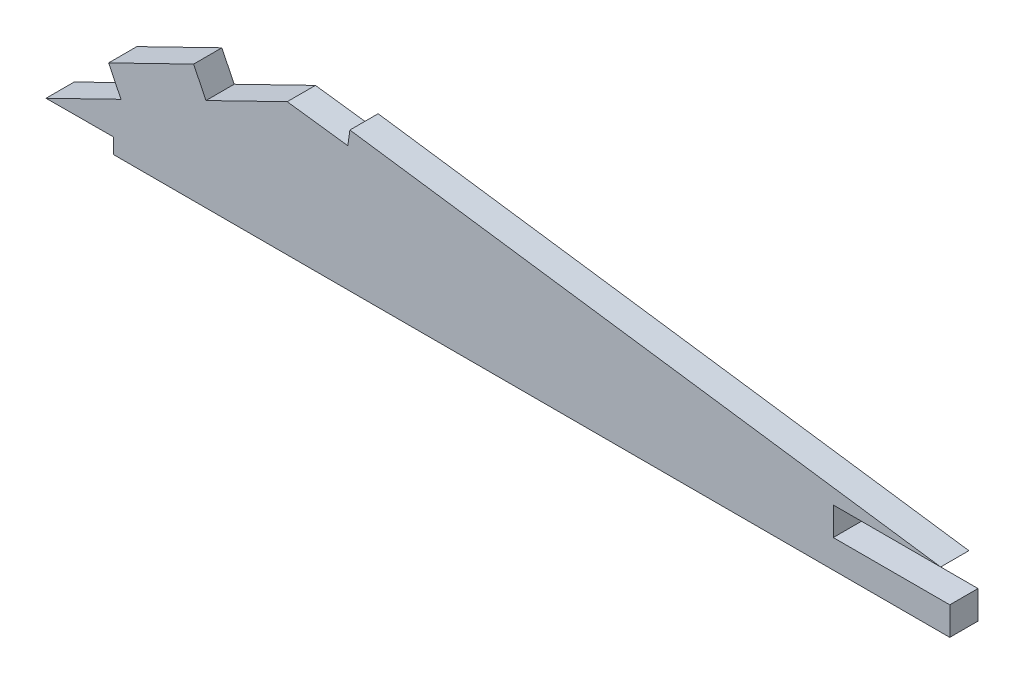
ISO-10303-21;
HEADER;
FILE_DESCRIPTION(('STEP AP214'),'2;1');
FILE_NAME('part.step','',(''),(''),'','','');
FILE_SCHEMA(('AUTOMOTIVE_DESIGN { 1 0 10303 214 1 1 1 1 }'));
ENDSEC;
DATA;
#1=APPLICATION_CONTEXT('core data for automotive mechanical design processes');
#2=APPLICATION_PROTOCOL_DEFINITION('international standard','automotive_design',2000,#1);
#3=PRODUCT_CONTEXT('',#1,'mechanical');
#4=PRODUCT('Part','Part','',(#3));
#5=PRODUCT_RELATED_PRODUCT_CATEGORY('part','',(#4));
#6=PRODUCT_DEFINITION_FORMATION('','',#4);
#7=PRODUCT_DEFINITION_CONTEXT('part definition',#1,'design');
#8=PRODUCT_DEFINITION('design','',#6,#7);
#9=PRODUCT_DEFINITION_SHAPE('','',#8);
#10=(LENGTH_UNIT() NAMED_UNIT(*) SI_UNIT(.MILLI.,.METRE.));
#11=(NAMED_UNIT(*) PLANE_ANGLE_UNIT() SI_UNIT($,.RADIAN.));
#12=(NAMED_UNIT(*) SI_UNIT($,.STERADIAN.) SOLID_ANGLE_UNIT());
#13=UNCERTAINTY_MEASURE_WITH_UNIT(LENGTH_MEASURE(1.E-05),#10,'distance_accuracy_value','');
#14=(GEOMETRIC_REPRESENTATION_CONTEXT(3) GLOBAL_UNCERTAINTY_ASSIGNED_CONTEXT((#13)) GLOBAL_UNIT_ASSIGNED_CONTEXT((#10,
#11,#12)) REPRESENTATION_CONTEXT('',''));
#15=CARTESIAN_POINT('',(0.,0.,0.));
#16=DIRECTION('',(0.,0.,1.));
#17=DIRECTION('',(1.,0.,0.));
#18=AXIS2_PLACEMENT_3D('',#15,#16,#17);
#19=CARTESIAN_POINT('',(6.87014244644078,3.92865761709263,2.));
#20=DIRECTION('',(-0.00388084579369452,0.999992469489609,0.));
#21=DIRECTION('',(-0.999992469489609,-0.00388084579369452,0.));
#22=AXIS2_PLACEMENT_3D('',#19,#20,#21);
#23=PLANE('',#22);
#24=DIRECTION('',(0.999992469489609,0.00388084579369452,0.));
#25=VECTOR('',#24,1.);
#26=CARTESIAN_POINT('',(6.87014244644078,3.92865761709263,0.));
#27=LINE('',#26,#25);
#28=CARTESIAN_POINT('',(2.08867664819272,3.91010134592361,0.));
#29=VERTEX_POINT('',#28);
#30=CARTESIAN_POINT('',(6.87014244644078,3.92865761709263,0.));
#31=VERTEX_POINT('',#30);
#32=EDGE_CURVE('E182',#29,#31,#27,.T.);
#33=ORIENTED_EDGE('',*,*,#32,.T.);
#34=DIRECTION('',(0.,0.,-1.));
#35=VECTOR('',#34,1.);
#36=CARTESIAN_POINT('',(6.87014244644078,3.92865761709263,2.));
#37=LINE('',#36,#35);
#38=CARTESIAN_POINT('',(6.87014244644078,3.92865761709263,2.));
#39=VERTEX_POINT('',#38);
#40=EDGE_CURVE('E11',#39,#31,#37,.T.);
#41=ORIENTED_EDGE('',*,*,#40,.F.);
#42=DIRECTION('',(0.999992469489609,0.00388084579369452,0.));
#43=VECTOR('',#42,1.);
#44=CARTESIAN_POINT('',(6.87014244644078,3.92865761709263,2.));
#45=LINE('',#44,#43);
#46=CARTESIAN_POINT('',(2.08867664819272,3.91010134592361,2.));
#47=VERTEX_POINT('',#46);
#48=EDGE_CURVE('E225',#47,#39,#45,.T.);
#49=ORIENTED_EDGE('',*,*,#48,.F.);
#50=DIRECTION('',(0.,0.,-1.));
#51=VECTOR('',#50,1.);
#52=CARTESIAN_POINT('',(2.08867664819272,3.91010134592361,2.));
#53=LINE('',#52,#51);
#54=EDGE_CURVE('E178',#47,#29,#53,.T.);
#55=ORIENTED_EDGE('',*,*,#54,.T.);
#56=EDGE_LOOP('',(#33,#41,#49,#55));
#57=FACE_BOUND('',#56,.T.);
#58=ADVANCED_FACE('F39',(#57),#23,.F.);
#59=CARTESIAN_POINT('',(6.87434607090663,2.84549352427084,2.));
#60=DIRECTION('',(0.99999246948962,0.00388084579083142,0.));
#61=DIRECTION('',(-0.00388084579083142,0.99999246948962,0.));
#62=AXIS2_PLACEMENT_3D('',#59,#60,#61);
#63=PLANE('',#62);
#64=DIRECTION('',(0.00388084579083142,-0.99999246948962,0.));
#65=VECTOR('',#64,1.);
#66=CARTESIAN_POINT('',(6.87434607090663,2.84549352427084,0.));
#67=LINE('',#66,#65);
#68=CARTESIAN_POINT('',(6.87434607090663,2.84549352427084,0.));
#69=VERTEX_POINT('',#68);
#70=EDGE_CURVE('E186',#31,#69,#67,.T.);
#71=ORIENTED_EDGE('',*,*,#70,.T.);
#72=DIRECTION('',(0.,0.,-1.));
#73=VECTOR('',#72,1.);
#74=CARTESIAN_POINT('',(6.87434607090663,2.84549352427084,2.));
#75=LINE('',#74,#73);
#76=CARTESIAN_POINT('',(6.87434607090663,2.84549352427084,2.));
#77=VERTEX_POINT('',#76);
#78=EDGE_CURVE('E48',#77,#69,#75,.T.);
#79=ORIENTED_EDGE('',*,*,#78,.F.);
#80=DIRECTION('',(0.00388084579083142,-0.99999246948962,0.));
#81=VECTOR('',#80,1.);
#82=CARTESIAN_POINT('',(6.87434607090663,2.84549352427084,2.));
#83=LINE('',#82,#81);
#84=EDGE_CURVE('E120',#39,#77,#83,.T.);
#85=ORIENTED_EDGE('',*,*,#84,.F.);
#86=ORIENTED_EDGE('',*,*,#40,.T.);
#87=EDGE_LOOP('',(#71,#79,#85,#86));
#88=FACE_BOUND('',#87,.T.);
#89=ADVANCED_FACE('F340',(#88),#63,.F.);
#90=CARTESIAN_POINT('',(6.87434607090663,2.84549352427084,2.));
#91=DIRECTION('',(0.,1.,0.));
#92=DIRECTION('',(0.,0.,1.));
#93=AXIS2_PLACEMENT_3D('',#90,#91,#92);
#94=PLANE('',#93);
#95=DIRECTION('',(1.,0.,0.));
#96=VECTOR('',#95,1.);
#97=CARTESIAN_POINT('',(6.87434607090663,2.84549352427084,0.));
#98=LINE('',#97,#96);
#99=CARTESIAN_POINT('',(66.1354490341429,2.84549352427084,0.));
#100=VERTEX_POINT('',#99);
#101=EDGE_CURVE('E189',#69,#100,#98,.T.);
#102=ORIENTED_EDGE('',*,*,#101,.T.);
#103=DIRECTION('',(0.,0.,-1.));
#104=VECTOR('',#103,1.);
#105=CARTESIAN_POINT('',(66.1354490341429,2.84549352427084,2.));
#106=LINE('',#105,#104);
#107=CARTESIAN_POINT('',(66.1354490341429,2.84549352427084,2.));
#108=VERTEX_POINT('',#107);
#109=EDGE_CURVE('E264',#108,#100,#106,.T.);
#110=ORIENTED_EDGE('',*,*,#109,.F.);
#111=DIRECTION('',(1.,0.,0.));
#112=VECTOR('',#111,1.);
#113=CARTESIAN_POINT('',(6.87434607090663,2.84549352427084,2.));
#114=LINE('',#113,#112);
#115=EDGE_CURVE('E274',#77,#108,#114,.T.);
#116=ORIENTED_EDGE('',*,*,#115,.F.);
#117=ORIENTED_EDGE('',*,*,#78,.T.);
#118=EDGE_LOOP('',(#102,#110,#116,#117));
#119=FACE_BOUND('',#118,.T.);
#120=ADVANCED_FACE('F272',(#119),#94,.F.);
#121=CARTESIAN_POINT('',(66.1354490341429,2.84549352427084,2.));
#122=DIRECTION('',(-1.,0.,0.));
#123=DIRECTION('',(0.,0.,1.));
#124=AXIS2_PLACEMENT_3D('',#121,#122,#123);
#125=PLANE('',#124);
#126=DIRECTION('',(0.,1.,0.));
#127=VECTOR('',#126,1.);
#128=CARTESIAN_POINT('',(66.1354490341429,2.84549352427084,0.));
#129=LINE('',#128,#127);
#130=CARTESIAN_POINT('',(66.1354490341429,4.84549352427084,0.));
#131=VERTEX_POINT('',#130);
#132=EDGE_CURVE('E192',#100,#131,#129,.T.);
#133=ORIENTED_EDGE('',*,*,#132,.T.);
#134=DIRECTION('',(0.,0.,-1.));
#135=VECTOR('',#134,1.);
#136=CARTESIAN_POINT('',(66.1354490341429,4.84549352427084,2.));
#137=LINE('',#136,#135);
#138=CARTESIAN_POINT('',(66.1354490341429,4.84549352427084,2.));
#139=VERTEX_POINT('',#138);
#140=EDGE_CURVE('E260',#139,#131,#137,.T.);
#141=ORIENTED_EDGE('',*,*,#140,.F.);
#142=DIRECTION('',(0.,1.,0.));
#143=VECTOR('',#142,1.);
#144=CARTESIAN_POINT('',(66.1354490341429,2.84549352427084,2.));
#145=LINE('',#144,#143);
#146=EDGE_CURVE('E293',#108,#139,#145,.T.);
#147=ORIENTED_EDGE('',*,*,#146,.F.);
#148=ORIENTED_EDGE('',*,*,#109,.T.);
#149=EDGE_LOOP('',(#133,#141,#147,#148));
#150=FACE_BOUND('',#149,.T.);
#151=ADVANCED_FACE('F283',(#150),#125,.F.);
#152=CARTESIAN_POINT('',(57.8792726381617,4.84549352427084,2.));
#153=DIRECTION('',(0.,-1.,0.));
#154=DIRECTION('',(0.,0.,-1.));
#155=AXIS2_PLACEMENT_3D('',#152,#153,#154);
#156=PLANE('',#155);
#157=DIRECTION('',(-1.,0.,0.));
#158=VECTOR('',#157,1.);
#159=CARTESIAN_POINT('',(57.8792726381617,4.84549352427084,0.));
#160=LINE('',#159,#158);
#161=CARTESIAN_POINT('',(57.8792726381617,4.84549352427084,0.));
#162=VERTEX_POINT('',#161);
#163=EDGE_CURVE('E195',#131,#162,#160,.T.);
#164=ORIENTED_EDGE('',*,*,#163,.T.);
#165=DIRECTION('',(0.,0.,-1.));
#166=VECTOR('',#165,1.);
#167=CARTESIAN_POINT('',(57.8792726381617,4.84549352427084,2.));
#168=LINE('',#167,#166);
#169=CARTESIAN_POINT('',(57.8792726381617,4.84549352427084,2.));
#170=VERTEX_POINT('',#169);
#171=EDGE_CURVE('E256',#170,#162,#168,.T.);
#172=ORIENTED_EDGE('',*,*,#171,.F.);
#173=DIRECTION('',(-1.,0.,0.));
#174=VECTOR('',#173,1.);
#175=CARTESIAN_POINT('',(57.8792726381617,4.84549352427084,2.));
#176=LINE('',#175,#174);
#177=EDGE_CURVE('E289',#139,#170,#176,.T.);
#178=ORIENTED_EDGE('',*,*,#177,.F.);
#179=ORIENTED_EDGE('',*,*,#140,.T.);
#180=EDGE_LOOP('',(#164,#172,#178,#179));
#181=FACE_BOUND('',#180,.T.);
#182=ADVANCED_FACE('F287',(#181),#156,.F.);
#183=CARTESIAN_POINT('',(57.8792726381617,4.84549352427084,2.));
#184=DIRECTION('',(-1.,0.,0.));
#185=DIRECTION('',(0.,0.,1.));
#186=AXIS2_PLACEMENT_3D('',#183,#184,#185);
#187=PLANE('',#186);
#188=DIRECTION('',(0.,1.,0.));
#189=VECTOR('',#188,1.);
#190=CARTESIAN_POINT('',(57.8792726381617,4.84549352427084,0.));
#191=LINE('',#190,#189);
#192=CARTESIAN_POINT('',(57.8792726381617,6.84549352427084,0.));
#193=VERTEX_POINT('',#192);
#194=EDGE_CURVE('E198',#162,#193,#191,.T.);
#195=ORIENTED_EDGE('',*,*,#194,.T.);
#196=DIRECTION('',(0.,0.,-1.));
#197=VECTOR('',#196,1.);
#198=CARTESIAN_POINT('',(57.8792726381617,6.84549352427084,2.));
#199=LINE('',#198,#197);
#200=CARTESIAN_POINT('',(57.8792726381617,6.84549352427084,2.));
#201=VERTEX_POINT('',#200);
#202=EDGE_CURVE('E252',#201,#193,#199,.T.);
#203=ORIENTED_EDGE('',*,*,#202,.F.);
#204=DIRECTION('',(0.,1.,0.));
#205=VECTOR('',#204,1.);
#206=CARTESIAN_POINT('',(57.8792726381617,4.84549352427084,2.));
#207=LINE('',#206,#205);
#208=EDGE_CURVE('E292',#170,#201,#207,.T.);
#209=ORIENTED_EDGE('',*,*,#208,.F.);
#210=ORIENTED_EDGE('',*,*,#171,.T.);
#211=EDGE_LOOP('',(#195,#203,#209,#210));
#212=FACE_BOUND('',#211,.T.);
#213=ADVANCED_FACE('F353',(#212),#187,.F.);
#214=CARTESIAN_POINT('',(57.8792726381617,6.84549352427084,2.));
#215=DIRECTION('',(0.,1.,0.));
#216=DIRECTION('',(-1.,0.,0.));
#217=AXIS2_PLACEMENT_3D('',#214,#215,#216);
#218=PLANE('',#217);
#219=DIRECTION('',(1.,0.,0.));
#220=VECTOR('',#219,1.);
#221=CARTESIAN_POINT('',(57.8792726381617,6.84549352427084,0.));
#222=LINE('',#221,#220);
#223=CARTESIAN_POINT('',(65.4894433207147,6.84549352427129,0.));
#224=VERTEX_POINT('',#223);
#225=EDGE_CURVE('E201',#193,#224,#222,.T.);
#226=ORIENTED_EDGE('',*,*,#225,.T.);
#227=DIRECTION('',(0.,0.,-1.));
#228=VECTOR('',#227,1.);
#229=CARTESIAN_POINT('',(65.4894433207147,6.84549352427129,2.));
#230=LINE('',#229,#228);
#231=CARTESIAN_POINT('',(65.4894433207147,6.84549352427129,2.));
#232=VERTEX_POINT('',#231);
#233=EDGE_CURVE('E248',#232,#224,#230,.T.);
#234=ORIENTED_EDGE('',*,*,#233,.F.);
#235=DIRECTION('',(1.,0.,0.));
#236=VECTOR('',#235,1.);
#237=CARTESIAN_POINT('',(57.8792726381617,6.84549352427084,2.));
#238=LINE('',#237,#236);
#239=EDGE_CURVE('E297',#201,#232,#238,.T.);
#240=ORIENTED_EDGE('',*,*,#239,.F.);
#241=ORIENTED_EDGE('',*,*,#202,.T.);
#242=EDGE_LOOP('',(#226,#234,#240,#241));
#243=FACE_BOUND('',#242,.T.);
#244=ADVANCED_FACE('F356',(#243),#218,.F.);
#245=CARTESIAN_POINT('',(23.6243141185087,12.7292537272739,2.));
#246=DIRECTION('',(-0.139173100960091,-0.990268068741567,0.));
#247=DIRECTION('',(0.990268068741567,-0.139173100960091,0.));
#248=AXIS2_PLACEMENT_3D('',#245,#246,#247);
#249=PLANE('',#248);
#250=DIRECTION('',(-0.990268068741567,0.139173100960091,0.));
#251=VECTOR('',#250,1.);
#252=CARTESIAN_POINT('',(23.6243141185087,12.7292537272739,0.));
#253=LINE('',#252,#251);
#254=CARTESIAN_POINT('',(23.6243141185087,12.7292537272739,0.));
#255=VERTEX_POINT('',#254);
#256=EDGE_CURVE('E204',#224,#255,#253,.T.);
#257=ORIENTED_EDGE('',*,*,#256,.T.);
#258=DIRECTION('',(0.,0.,-1.));
#259=VECTOR('',#258,1.);
#260=CARTESIAN_POINT('',(23.6243141185087,12.7292537272739,2.));
#261=LINE('',#260,#259);
#262=CARTESIAN_POINT('',(23.6243141185087,12.7292537272739,2.));
#263=VERTEX_POINT('',#262);
#264=EDGE_CURVE('E244',#263,#255,#261,.T.);
#265=ORIENTED_EDGE('',*,*,#264,.F.);
#266=DIRECTION('',(-0.990268068741567,0.139173100960091,0.));
#267=VECTOR('',#266,1.);
#268=CARTESIAN_POINT('',(23.6243141185087,12.7292537272739,2.));
#269=LINE('',#268,#267);
#270=EDGE_CURVE('E304',#232,#263,#269,.T.);
#271=ORIENTED_EDGE('',*,*,#270,.F.);
#272=ORIENTED_EDGE('',*,*,#233,.T.);
#273=EDGE_LOOP('',(#257,#265,#271,#272));
#274=FACE_BOUND('',#273,.T.);
#275=ADVANCED_FACE('F360',(#274),#249,.F.);
#276=CARTESIAN_POINT('',(23.4761040657177,11.6915614698183,2.));
#277=DIRECTION('',(0.989953726819028,-0.141391720963843,0.));
#278=DIRECTION('',(0.141391720963843,0.989953726819028,0.));
#279=AXIS2_PLACEMENT_3D('',#276,#277,#278);
#280=PLANE('',#279);
#281=DIRECTION('',(-0.141391720963843,-0.989953726819028,0.));
#282=VECTOR('',#281,1.);
#283=CARTESIAN_POINT('',(23.4761040657177,11.6915614698183,0.));
#284=LINE('',#283,#282);
#285=CARTESIAN_POINT('',(23.4761040657177,11.6915614698183,0.));
#286=VERTEX_POINT('',#285);
#287=EDGE_CURVE('E207',#255,#286,#284,.T.);
#288=ORIENTED_EDGE('',*,*,#287,.T.);
#289=DIRECTION('',(0.,0.,-1.));
#290=VECTOR('',#289,1.);
#291=CARTESIAN_POINT('',(23.4761040657177,11.6915614698183,2.));
#292=LINE('',#291,#290);
#293=CARTESIAN_POINT('',(23.4761040657177,11.6915614698183,2.));
#294=VERTEX_POINT('',#293);
#295=EDGE_CURVE('E240',#294,#286,#292,.T.);
#296=ORIENTED_EDGE('',*,*,#295,.F.);
#297=DIRECTION('',(-0.141391720963843,-0.989953726819028,0.));
#298=VECTOR('',#297,1.);
#299=CARTESIAN_POINT('',(23.4761040657177,11.6915614698183,2.));
#300=LINE('',#299,#298);
#301=EDGE_CURVE('E307',#263,#294,#300,.T.);
#302=ORIENTED_EDGE('',*,*,#301,.F.);
#303=ORIENTED_EDGE('',*,*,#264,.T.);
#304=EDGE_LOOP('',(#288,#296,#302,#303));
#305=FACE_BOUND('',#304,.T.);
#306=ADVANCED_FACE('F364',(#305),#280,.F.);
#307=CARTESIAN_POINT('',(19.1818784423468,12.2470129038648,2.));
#308=DIRECTION('',(-0.128279776916055,-0.991738019254262,0.));
#309=DIRECTION('',(0.991738019254262,-0.128279776916055,0.));
#310=AXIS2_PLACEMENT_3D('',#307,#308,#309);
#311=PLANE('',#310);
#312=DIRECTION('',(-0.991738019254262,0.128279776916055,0.));
#313=VECTOR('',#312,1.);
#314=CARTESIAN_POINT('',(19.1818784423468,12.2470129038648,0.));
#315=LINE('',#314,#313);
#316=CARTESIAN_POINT('',(19.1818784423468,12.2470129038648,0.));
#317=VERTEX_POINT('',#316);
#318=EDGE_CURVE('E210',#286,#317,#315,.T.);
#319=ORIENTED_EDGE('',*,*,#318,.T.);
#320=DIRECTION('',(0.,0.,-1.));
#321=VECTOR('',#320,1.);
#322=CARTESIAN_POINT('',(19.1818784423468,12.2470129038648,2.));
#323=LINE('',#322,#321);
#324=CARTESIAN_POINT('',(19.1818784423468,12.2470129038648,2.));
#325=VERTEX_POINT('',#324);
#326=EDGE_CURVE('E236',#325,#317,#323,.T.);
#327=ORIENTED_EDGE('',*,*,#326,.F.);
#328=DIRECTION('',(-0.991738019254262,0.128279776916055,0.));
#329=VECTOR('',#328,1.);
#330=CARTESIAN_POINT('',(19.1818784423468,12.2470129038648,2.));
#331=LINE('',#330,#329);
#332=EDGE_CURVE('E310',#294,#325,#331,.T.);
#333=ORIENTED_EDGE('',*,*,#332,.F.);
#334=ORIENTED_EDGE('',*,*,#295,.T.);
#335=EDGE_LOOP('',(#319,#327,#333,#334));
#336=FACE_BOUND('',#335,.T.);
#337=ADVANCED_FACE('F368',(#336),#311,.F.);
#338=CARTESIAN_POINT('',(13.4256153513143,9.43949580601029,2.));
#339=DIRECTION('',(0.438371146788971,-0.898794046299219,0.));
#340=DIRECTION('',(0.898794046299219,0.438371146788971,0.));
#341=AXIS2_PLACEMENT_3D('',#338,#339,#340);
#342=PLANE('',#341);
#343=DIRECTION('',(-0.898794046299219,-0.438371146788971,0.));
#344=VECTOR('',#343,1.);
#345=CARTESIAN_POINT('',(13.4256153513143,9.43949580601029,0.));
#346=LINE('',#345,#344);
#347=CARTESIAN_POINT('',(13.4256153513143,9.43949580601029,0.));
#348=VERTEX_POINT('',#347);
#349=EDGE_CURVE('E213',#317,#348,#346,.T.);
#350=ORIENTED_EDGE('',*,*,#349,.T.);
#351=DIRECTION('',(0.,0.,-1.));
#352=VECTOR('',#351,1.);
#353=CARTESIAN_POINT('',(13.4256153513143,9.43949580601029,2.));
#354=LINE('',#353,#352);
#355=CARTESIAN_POINT('',(13.4256153513143,9.43949580601029,2.));
#356=VERTEX_POINT('',#355);
#357=EDGE_CURVE('E232',#356,#348,#354,.T.);
#358=ORIENTED_EDGE('',*,*,#357,.F.);
#359=DIRECTION('',(-0.898794046299219,-0.438371146788971,0.));
#360=VECTOR('',#359,1.);
#361=CARTESIAN_POINT('',(13.4256153513143,9.43949580601029,2.));
#362=LINE('',#361,#360);
#363=EDGE_CURVE('E313',#325,#356,#362,.T.);
#364=ORIENTED_EDGE('',*,*,#363,.F.);
#365=ORIENTED_EDGE('',*,*,#326,.T.);
#366=EDGE_LOOP('',(#350,#358,#364,#365));
#367=FACE_BOUND('',#366,.T.);
#368=ADVANCED_FACE('F321',(#367),#342,.F.);
#369=CARTESIAN_POINT('',(12.5488730577354,11.2370838986072,2.));
#370=DIRECTION('',(-0.898794046298885,-0.438371146789656,0.));
#371=DIRECTION('',(0.438371146789656,-0.898794046298885,0.));
#372=AXIS2_PLACEMENT_3D('',#369,#370,#371);
#373=PLANE('',#372);
#374=DIRECTION('',(-0.438371146789656,0.898794046298885,0.));
#375=VECTOR('',#374,1.);
#376=CARTESIAN_POINT('',(12.5488730577354,11.2370838986072,0.));
#377=LINE('',#376,#375);
#378=CARTESIAN_POINT('',(12.5488730577354,11.2370838986072,0.));
#379=VERTEX_POINT('',#378);
#380=EDGE_CURVE('E216',#348,#379,#377,.T.);
#381=ORIENTED_EDGE('',*,*,#380,.T.);
#382=DIRECTION('',(0.,0.,-1.));
#383=VECTOR('',#382,1.);
#384=CARTESIAN_POINT('',(12.5488730577354,11.2370838986072,2.));
#385=LINE('',#384,#383);
#386=CARTESIAN_POINT('',(12.5488730577354,11.2370838986072,2.));
#387=VERTEX_POINT('',#386);
#388=EDGE_CURVE('E171',#387,#379,#385,.T.);
#389=ORIENTED_EDGE('',*,*,#388,.F.);
#390=DIRECTION('',(-0.438371146789656,0.898794046298885,0.));
#391=VECTOR('',#390,1.);
#392=CARTESIAN_POINT('',(12.5488730577354,11.2370838986072,2.));
#393=LINE('',#392,#391);
#394=EDGE_CURVE('E160',#356,#387,#393,.T.);
#395=ORIENTED_EDGE('',*,*,#394,.F.);
#396=ORIENTED_EDGE('',*,*,#357,.T.);
#397=EDGE_LOOP('',(#381,#389,#395,#396));
#398=FACE_BOUND('',#397,.T.);
#399=ADVANCED_FACE('F325',(#398),#373,.F.);
#400=CARTESIAN_POINT('',(6.52650355046089,8.29977802952371,2.));
#401=DIRECTION('',(0.438371146789122,-0.898794046299145,0.));
#402=DIRECTION('',(0.898794046299145,0.438371146789122,0.));
#403=AXIS2_PLACEMENT_3D('',#400,#401,#402);
#404=PLANE('',#403);
#405=DIRECTION('',(-0.898794046299145,-0.438371146789122,0.));
#406=VECTOR('',#405,1.);
#407=CARTESIAN_POINT('',(6.52650355046089,8.29977802952371,0.));
#408=LINE('',#407,#406);
#409=CARTESIAN_POINT('',(6.52650355046089,8.29977802952371,0.));
#410=VERTEX_POINT('',#409);
#411=EDGE_CURVE('E169',#379,#410,#408,.T.);
#412=ORIENTED_EDGE('',*,*,#411,.T.);
#413=DIRECTION('',(0.,0.,-1.));
#414=VECTOR('',#413,1.);
#415=CARTESIAN_POINT('',(6.52650355046089,8.29977802952371,2.));
#416=LINE('',#415,#414);
#417=CARTESIAN_POINT('',(6.52650355046089,8.29977802952371,2.));
#418=VERTEX_POINT('',#417);
#419=EDGE_CURVE('E166',#418,#410,#416,.T.);
#420=ORIENTED_EDGE('',*,*,#419,.F.);
#421=DIRECTION('',(-0.898794046299145,-0.438371146789122,0.));
#422=VECTOR('',#421,1.);
#423=CARTESIAN_POINT('',(6.52650355046089,8.29977802952371,2.));
#424=LINE('',#423,#422);
#425=EDGE_CURVE('E154',#387,#418,#424,.T.);
#426=ORIENTED_EDGE('',*,*,#425,.F.);
#427=ORIENTED_EDGE('',*,*,#388,.T.);
#428=EDGE_LOOP('',(#412,#420,#426,#427));
#429=FACE_BOUND('',#428,.T.);
#430=ADVANCED_FACE('F167',(#429),#404,.F.);
#431=CARTESIAN_POINT('',(6.52650355046089,8.29977802952371,2.));
#432=DIRECTION('',(0.898794046299195,0.43837114678902,0.));
#433=DIRECTION('',(-0.43837114678902,0.898794046299195,0.));
#434=AXIS2_PLACEMENT_3D('',#431,#432,#433);
#435=PLANE('',#434);
#436=DIRECTION('',(0.43837114678902,-0.898794046299195,0.));
#437=VECTOR('',#436,1.);
#438=CARTESIAN_POINT('',(6.52650355046089,8.29977802952371,0.));
#439=LINE('',#438,#437);
#440=CARTESIAN_POINT('',(7.40324584403888,6.50218993692542,0.));
#441=VERTEX_POINT('',#440);
#442=EDGE_CURVE('E106',#410,#441,#439,.T.);
#443=ORIENTED_EDGE('',*,*,#442,.T.);
#444=DIRECTION('',(0.,0.,-1.));
#445=VECTOR('',#444,1.);
#446=CARTESIAN_POINT('',(7.40324584403888,6.50218993692542,2.));
#447=LINE('',#446,#445);
#448=CARTESIAN_POINT('',(7.40324584403888,6.50218993692542,2.));
#449=VERTEX_POINT('',#448);
#450=EDGE_CURVE('E172',#449,#441,#447,.T.);
#451=ORIENTED_EDGE('',*,*,#450,.F.);
#452=DIRECTION('',(0.43837114678902,-0.898794046299195,0.));
#453=VECTOR('',#452,1.);
#454=CARTESIAN_POINT('',(6.52650355046089,8.29977802952371,2.));
#455=LINE('',#454,#453);
#456=EDGE_CURVE('E158',#418,#449,#455,.T.);
#457=ORIENTED_EDGE('',*,*,#456,.F.);
#458=ORIENTED_EDGE('',*,*,#419,.T.);
#459=EDGE_LOOP('',(#443,#451,#457,#458));
#460=FACE_BOUND('',#459,.T.);
#461=ADVANCED_FACE('F174',(#460),#435,.F.);
#462=CARTESIAN_POINT('',(2.08867664819272,3.91010134592361,2.));
#463=DIRECTION('',(0.438371146788992,-0.898794046299209,0.));
#464=DIRECTION('',(0.898794046299209,0.438371146788992,0.));
#465=AXIS2_PLACEMENT_3D('',#462,#463,#464);
#466=PLANE('',#465);
#467=DIRECTION('',(-0.898794046299209,-0.438371146788992,0.));
#468=VECTOR('',#467,1.);
#469=CARTESIAN_POINT('',(2.08867664819272,3.91010134592361,0.));
#470=LINE('',#469,#468);
#471=EDGE_CURVE('E112',#441,#29,#470,.T.);
#472=ORIENTED_EDGE('',*,*,#471,.T.);
#473=ORIENTED_EDGE('',*,*,#54,.F.);
#474=DIRECTION('',(-0.898794046299209,-0.438371146788992,0.));
#475=VECTOR('',#474,1.);
#476=CARTESIAN_POINT('',(2.08867664819272,3.91010134592361,2.));
#477=LINE('',#476,#475);
#478=EDGE_CURVE('E56',#449,#47,#477,.T.);
#479=ORIENTED_EDGE('',*,*,#478,.F.);
#480=ORIENTED_EDGE('',*,*,#450,.T.);
#481=EDGE_LOOP('',(#472,#473,#479,#480));
#482=FACE_BOUND('',#481,.T.);
#483=ADVANCED_FACE('F329',(#482),#466,.F.);
#484=CARTESIAN_POINT('',(0.,0.,2.));
#485=DIRECTION('',(0.,0.,-1.));
#486=DIRECTION('',(-1.,0.,0.));
#487=AXIS2_PLACEMENT_3D('',#484,#485,#486);
#488=PLANE('',#487);
#489=ORIENTED_EDGE('',*,*,#48,.T.);
#490=ORIENTED_EDGE('',*,*,#84,.T.);
#491=ORIENTED_EDGE('',*,*,#115,.T.);
#492=ORIENTED_EDGE('',*,*,#146,.T.);
#493=ORIENTED_EDGE('',*,*,#177,.T.);
#494=ORIENTED_EDGE('',*,*,#208,.T.);
#495=ORIENTED_EDGE('',*,*,#239,.T.);
#496=ORIENTED_EDGE('',*,*,#270,.T.);
#497=ORIENTED_EDGE('',*,*,#301,.T.);
#498=ORIENTED_EDGE('',*,*,#332,.T.);
#499=ORIENTED_EDGE('',*,*,#363,.T.);
#500=ORIENTED_EDGE('',*,*,#394,.T.);
#501=ORIENTED_EDGE('',*,*,#425,.T.);
#502=ORIENTED_EDGE('',*,*,#456,.T.);
#503=ORIENTED_EDGE('',*,*,#478,.T.);
#504=EDGE_LOOP('',(#489,#490,#491,#492,#493,#494,#495,#496,#497,#498,#499,#500,#501,#502,#503));
#505=FACE_BOUND('',#504,.T.);
#506=ADVANCED_FACE('F156',(#505),#488,.F.);
#507=CARTESIAN_POINT('',(0.,0.,0.));
#508=DIRECTION('',(0.,0.,-1.));
#509=DIRECTION('',(-1.,0.,0.));
#510=AXIS2_PLACEMENT_3D('',#507,#508,#509);
#511=PLANE('',#510);
#512=ORIENTED_EDGE('',*,*,#32,.F.);
#513=ORIENTED_EDGE('',*,*,#471,.F.);
#514=ORIENTED_EDGE('',*,*,#442,.F.);
#515=ORIENTED_EDGE('',*,*,#411,.F.);
#516=ORIENTED_EDGE('',*,*,#380,.F.);
#517=ORIENTED_EDGE('',*,*,#349,.F.);
#518=ORIENTED_EDGE('',*,*,#318,.F.);
#519=ORIENTED_EDGE('',*,*,#287,.F.);
#520=ORIENTED_EDGE('',*,*,#256,.F.);
#521=ORIENTED_EDGE('',*,*,#225,.F.);
#522=ORIENTED_EDGE('',*,*,#194,.F.);
#523=ORIENTED_EDGE('',*,*,#163,.F.);
#524=ORIENTED_EDGE('',*,*,#132,.F.);
#525=ORIENTED_EDGE('',*,*,#101,.F.);
#526=ORIENTED_EDGE('',*,*,#70,.F.);
#527=EDGE_LOOP('',(#512,#513,#514,#515,#516,#517,#518,#519,#520,#521,#522,#523,#524,#525,#526));
#528=FACE_BOUND('',#527,.T.);
#529=ADVANCED_FACE('F278',(#528),#511,.T.);
#530=CLOSED_SHELL('',(#58,#89,#120,#151,#182,#213,#244,#275,#306,#337,#368,#399,#430,#461,#483,
#506,#529));
#531=MANIFOLD_SOLID_BREP('B2',#530);
#532=ADVANCED_BREP_SHAPE_REPRESENTATION('',(#18,#531),#14);
#533=SHAPE_DEFINITION_REPRESENTATION(#9,#532);
ENDSEC;
END-ISO-10303-21;
